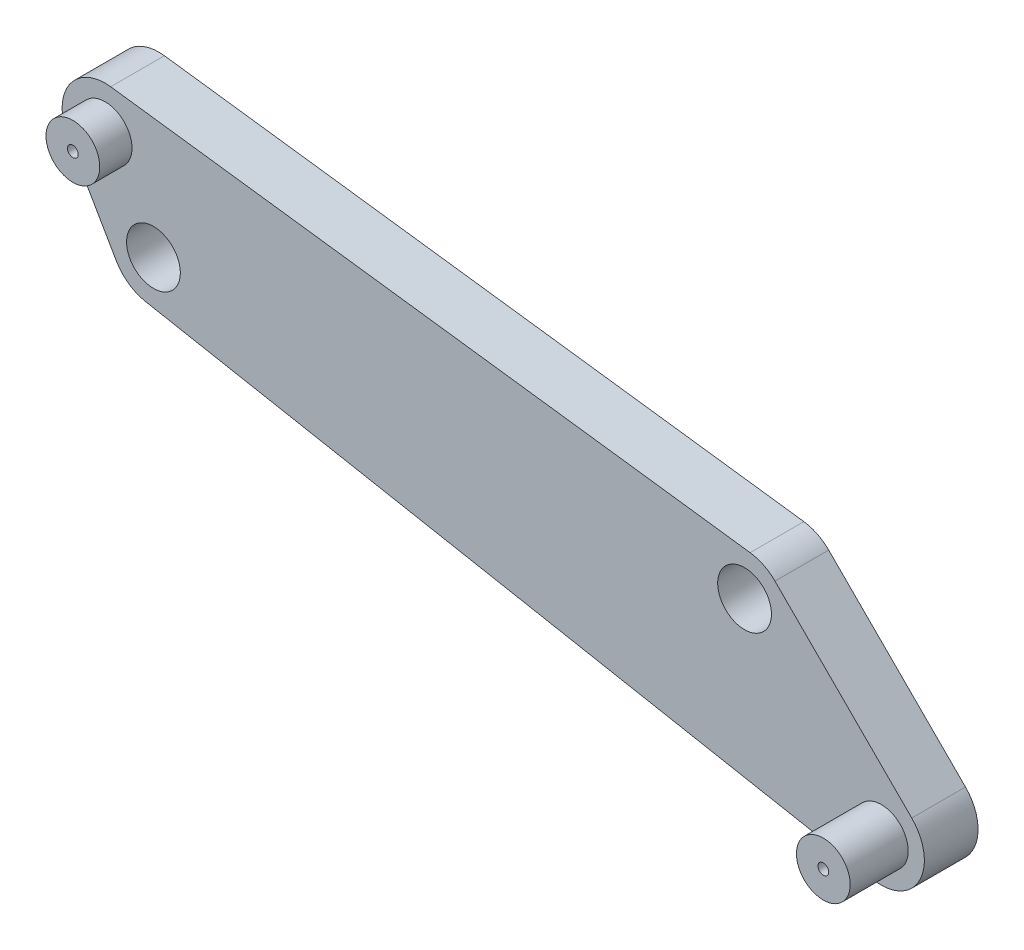
ISO-10303-21;
HEADER;
FILE_DESCRIPTION(('STEP AP214'),'2;1');
FILE_NAME('part.step','',(''),(''),'','','');
FILE_SCHEMA(('AUTOMOTIVE_DESIGN { 1 0 10303 214 1 1 1 1 }'));
ENDSEC;
DATA;
#1=APPLICATION_CONTEXT('core data for automotive mechanical design processes');
#2=APPLICATION_PROTOCOL_DEFINITION('international standard','automotive_design',2000,#1);
#3=PRODUCT_CONTEXT('',#1,'mechanical');
#4=PRODUCT('Part','Part','',(#3));
#5=PRODUCT_RELATED_PRODUCT_CATEGORY('part','',(#4));
#6=PRODUCT_DEFINITION_FORMATION('','',#4);
#7=PRODUCT_DEFINITION_CONTEXT('part definition',#1,'design');
#8=PRODUCT_DEFINITION('design','',#6,#7);
#9=PRODUCT_DEFINITION_SHAPE('','',#8);
#10=(LENGTH_UNIT() NAMED_UNIT(*) SI_UNIT(.MILLI.,.METRE.));
#11=(NAMED_UNIT(*) PLANE_ANGLE_UNIT() SI_UNIT($,.RADIAN.));
#12=(NAMED_UNIT(*) SI_UNIT($,.STERADIAN.) SOLID_ANGLE_UNIT());
#13=UNCERTAINTY_MEASURE_WITH_UNIT(LENGTH_MEASURE(1.E-05),#10,'distance_accuracy_value','');
#14=(GEOMETRIC_REPRESENTATION_CONTEXT(3) GLOBAL_UNCERTAINTY_ASSIGNED_CONTEXT((#13)) GLOBAL_UNIT_ASSIGNED_CONTEXT((#10,
#11,#12)) REPRESENTATION_CONTEXT('',''));
#15=CARTESIAN_POINT('',(0.,0.,0.));
#16=DIRECTION('',(0.,0.,1.));
#17=DIRECTION('',(1.,0.,0.));
#18=AXIS2_PLACEMENT_3D('',#15,#16,#17);
#19=CARTESIAN_POINT('',(-55.,0.,5.));
#20=DIRECTION('',(0.,0.,1.));
#21=DIRECTION('',(1.,0.,0.));
#22=AXIS2_PLACEMENT_3D('',#19,#20,#21);
#23=PLANE('',#22);
#24=CARTESIAN_POINT('',(0.,0.,5.));
#25=DIRECTION('',(0.,0.,1.));
#26=DIRECTION('',(1.,0.,0.));
#27=AXIS2_PLACEMENT_3D('',#24,#25,#26);
#28=CIRCLE('',#27,2.5);
#29=CARTESIAN_POINT('',(2.5,0.,5.));
#30=VERTEX_POINT('',#29);
#31=EDGE_CURVE('E188',#30,#30,#28,.T.);
#32=ORIENTED_EDGE('',*,*,#31,.F.);
#33=EDGE_LOOP('',(#32));
#34=FACE_BOUND('',#33,.T.);
#35=CARTESIAN_POINT('',(-55.,0.,5.));
#36=DIRECTION('',(0.,0.,1.));
#37=DIRECTION('',(1.,0.,0.));
#38=AXIS2_PLACEMENT_3D('',#35,#36,#37);
#39=CIRCLE('',#38,2.5);
#40=CARTESIAN_POINT('',(-52.5,0.,5.));
#41=VERTEX_POINT('',#40);
#42=EDGE_CURVE('E135',#41,#41,#39,.T.);
#43=ORIENTED_EDGE('',*,*,#42,.F.);
#44=EDGE_LOOP('',(#43));
#45=FACE_BOUND('',#44,.T.);
#46=CARTESIAN_POINT('',(-55.,0.,5.));
#47=DIRECTION('',(0.,0.,1.));
#48=DIRECTION('',(1.,0.,0.));
#49=AXIS2_PLACEMENT_3D('',#46,#47,#48);
#50=CIRCLE('',#49,4.00000000000001);
#51=CARTESIAN_POINT('',(-58.4641016151378,-2.,5.));
#52=VERTEX_POINT('',#51);
#53=CARTESIAN_POINT('',(-55.7387766284219,-3.93118418460618,5.));
#54=VERTEX_POINT('',#53);
#55=EDGE_CURVE('E146',#52,#54,#50,.T.);
#56=ORIENTED_EDGE('',*,*,#55,.T.);
#57=DIRECTION('',(0.98279604615154,-0.184694157105469,0.));
#58=VECTOR('',#57,1.);
#59=CARTESIAN_POINT('',(11.9891454329361,-16.6591062459639,5.));
#60=LINE('',#59,#58);
#61=CARTESIAN_POINT('',(11.9891454329361,-16.6591062459639,5.));
#62=VERTEX_POINT('',#61);
#63=EDGE_CURVE('E94',#54,#62,#60,.T.);
#64=ORIENTED_EDGE('',*,*,#63,.T.);
#65=CARTESIAN_POINT('',(12.7279220613579,-12.7279220613578,5.));
#66=DIRECTION('',(0.,0.,1.));
#67=DIRECTION('',(1.,0.,0.));
#68=AXIS2_PLACEMENT_3D('',#65,#66,#67);
#69=CIRCLE('',#68,4.);
#70=CARTESIAN_POINT('',(15.5563491861041,-9.89949493661158,5.));
#71=VERTEX_POINT('',#70);
#72=EDGE_CURVE('E161',#62,#71,#69,.T.);
#73=ORIENTED_EDGE('',*,*,#72,.T.);
#74=DIRECTION('',(-0.707106781186552,0.707106781186543,0.));
#75=VECTOR('',#74,1.);
#76=CARTESIAN_POINT('',(2.82842712474617,2.82842712474621,5.));
#77=LINE('',#76,#75);
#78=CARTESIAN_POINT('',(2.82842712474617,2.82842712474621,5.));
#79=VERTEX_POINT('',#78);
#80=EDGE_CURVE('E174',#71,#79,#77,.T.);
#81=ORIENTED_EDGE('',*,*,#80,.T.);
#82=CARTESIAN_POINT('',(0.,0.,5.));
#83=DIRECTION('',(0.,0.,1.));
#84=DIRECTION('',(1.,0.,0.));
#85=AXIS2_PLACEMENT_3D('',#82,#83,#84);
#86=CIRCLE('',#85,4.);
#87=CARTESIAN_POINT('',(0.519543088518699,3.96611585549041,5.));
#88=VERTEX_POINT('',#87);
#89=EDGE_CURVE('E113',#79,#88,#86,.T.);
#90=ORIENTED_EDGE('',*,*,#89,.T.);
#91=DIRECTION('',(-0.991528963872603,0.129885772129675,0.));
#92=VECTOR('',#91,1.);
#93=CARTESIAN_POINT('',(-58.9804569114813,11.7603444895504,5.));
#94=LINE('',#93,#92);
#95=CARTESIAN_POINT('',(-58.9804569114813,11.7603444895504,5.));
#96=VERTEX_POINT('',#95);
#97=EDGE_CURVE('E107',#88,#96,#94,.T.);
#98=ORIENTED_EDGE('',*,*,#97,.T.);
#99=CARTESIAN_POINT('',(-59.5,7.79422863405995,5.));
#100=DIRECTION('',(0.,0.,1.));
#101=DIRECTION('',(1.,0.,0.));
#102=AXIS2_PLACEMENT_3D('',#99,#100,#101);
#103=CIRCLE('',#102,4.);
#104=CARTESIAN_POINT('',(-62.9641016151377,5.79422863405996,5.));
#105=VERTEX_POINT('',#104);
#106=EDGE_CURVE('E111',#96,#105,#103,.T.);
#107=ORIENTED_EDGE('',*,*,#106,.T.);
#108=DIRECTION('',(0.499999999999997,-0.86602540378444,0.));
#109=VECTOR('',#108,1.);
#110=CARTESIAN_POINT('',(-58.4641016151378,-2.,5.));
#111=LINE('',#110,#109);
#112=EDGE_CURVE('E51',#105,#52,#111,.T.);
#113=ORIENTED_EDGE('',*,*,#112,.T.);
#114=EDGE_LOOP('',(#56,#64,#73,#81,#90,#98,#107,#113));
#115=FACE_BOUND('',#114,.T.);
#116=CARTESIAN_POINT('',(-59.5,7.79422863405995,5.));
#117=DIRECTION('',(0.,0.,1.));
#118=DIRECTION('',(1.,0.,0.));
#119=AXIS2_PLACEMENT_3D('',#116,#117,#118);
#120=CIRCLE('',#119,2.50000000000001);
#121=CARTESIAN_POINT('',(-57.,7.79422863405995,5.));
#122=VERTEX_POINT('',#121);
#123=EDGE_CURVE('E183',#122,#122,#120,.T.);
#124=ORIENTED_EDGE('',*,*,#123,.F.);
#125=EDGE_LOOP('',(#124));
#126=FACE_BOUND('',#125,.T.);
#127=CARTESIAN_POINT('',(12.7279220613579,-12.7279220613578,5.));
#128=DIRECTION('',(0.,0.,1.));
#129=DIRECTION('',(1.,0.,0.));
#130=AXIS2_PLACEMENT_3D('',#127,#128,#129);
#131=CIRCLE('',#130,2.5);
#132=CARTESIAN_POINT('',(15.2279220613579,-12.7279220613578,5.));
#133=VERTEX_POINT('',#132);
#134=EDGE_CURVE('E192',#133,#133,#131,.T.);
#135=ORIENTED_EDGE('',*,*,#134,.F.);
#136=EDGE_LOOP('',(#135));
#137=FACE_BOUND('',#136,.T.);
#138=ADVANCED_FACE('F34',(#34,#45,#115,#126,#137),#23,.T.);
#139=CARTESIAN_POINT('',(-55.,0.,0.));
#140=DIRECTION('',(0.,0.,1.));
#141=DIRECTION('',(1.,0.,0.));
#142=AXIS2_PLACEMENT_3D('',#139,#140,#141);
#143=PLANE('',#142);
#144=CARTESIAN_POINT('',(-55.,0.,0.));
#145=DIRECTION('',(0.,0.,1.));
#146=DIRECTION('',(1.,0.,0.));
#147=AXIS2_PLACEMENT_3D('',#144,#145,#146);
#148=CIRCLE('',#147,4.00000000000001);
#149=CARTESIAN_POINT('',(-58.4641016151378,-2.,0.));
#150=VERTEX_POINT('',#149);
#151=CARTESIAN_POINT('',(-55.7387766284219,-3.93118418460618,0.));
#152=VERTEX_POINT('',#151);
#153=EDGE_CURVE('E131',#150,#152,#148,.T.);
#154=ORIENTED_EDGE('',*,*,#153,.F.);
#155=DIRECTION('',(0.499999999999997,-0.86602540378444,0.));
#156=VECTOR('',#155,1.);
#157=CARTESIAN_POINT('',(-58.4641016151378,-2.,0.));
#158=LINE('',#157,#156);
#159=CARTESIAN_POINT('',(-62.9641016151377,5.79422863405996,0.));
#160=VERTEX_POINT('',#159);
#161=EDGE_CURVE('E86',#160,#150,#158,.T.);
#162=ORIENTED_EDGE('',*,*,#161,.F.);
#163=CARTESIAN_POINT('',(-59.5,7.79422863405995,0.));
#164=DIRECTION('',(0.,0.,1.));
#165=DIRECTION('',(1.,0.,0.));
#166=AXIS2_PLACEMENT_3D('',#163,#164,#165);
#167=CIRCLE('',#166,4.);
#168=CARTESIAN_POINT('',(-58.9804569114813,11.7603444895504,0.));
#169=VERTEX_POINT('',#168);
#170=EDGE_CURVE('E80',#169,#160,#167,.T.);
#171=ORIENTED_EDGE('',*,*,#170,.F.);
#172=DIRECTION('',(-0.991528963872603,0.129885772129675,0.));
#173=VECTOR('',#172,1.);
#174=CARTESIAN_POINT('',(-58.9804569114813,11.7603444895504,0.));
#175=LINE('',#174,#173);
#176=CARTESIAN_POINT('',(0.519543088518699,3.96611585549041,0.));
#177=VERTEX_POINT('',#176);
#178=EDGE_CURVE('E121',#177,#169,#175,.T.);
#179=ORIENTED_EDGE('',*,*,#178,.F.);
#180=CARTESIAN_POINT('',(0.,0.,0.));
#181=DIRECTION('',(0.,0.,1.));
#182=DIRECTION('',(1.,0.,0.));
#183=AXIS2_PLACEMENT_3D('',#180,#181,#182);
#184=CIRCLE('',#183,4.);
#185=CARTESIAN_POINT('',(2.82842712474617,2.82842712474621,0.));
#186=VERTEX_POINT('',#185);
#187=EDGE_CURVE('E141',#186,#177,#184,.T.);
#188=ORIENTED_EDGE('',*,*,#187,.F.);
#189=DIRECTION('',(-0.707106781186552,0.707106781186543,0.));
#190=VECTOR('',#189,1.);
#191=CARTESIAN_POINT('',(2.82842712474617,2.82842712474621,0.));
#192=LINE('',#191,#190);
#193=CARTESIAN_POINT('',(15.5563491861041,-9.89949493661158,0.));
#194=VERTEX_POINT('',#193);
#195=EDGE_CURVE('E139',#194,#186,#192,.T.);
#196=ORIENTED_EDGE('',*,*,#195,.F.);
#197=CARTESIAN_POINT('',(12.7279220613579,-12.7279220613578,0.));
#198=DIRECTION('',(0.,0.,1.));
#199=DIRECTION('',(1.,0.,0.));
#200=AXIS2_PLACEMENT_3D('',#197,#198,#199);
#201=CIRCLE('',#200,4.);
#202=CARTESIAN_POINT('',(11.9891454329361,-16.6591062459639,0.));
#203=VERTEX_POINT('',#202);
#204=EDGE_CURVE('E137',#203,#194,#201,.T.);
#205=ORIENTED_EDGE('',*,*,#204,.F.);
#206=DIRECTION('',(0.98279604615154,-0.184694157105469,0.));
#207=VECTOR('',#206,1.);
#208=CARTESIAN_POINT('',(11.9891454329361,-16.6591062459639,0.));
#209=LINE('',#208,#207);
#210=EDGE_CURVE('E134',#152,#203,#209,.T.);
#211=ORIENTED_EDGE('',*,*,#210,.F.);
#212=EDGE_LOOP('',(#154,#162,#171,#179,#188,#196,#205,#211));
#213=FACE_BOUND('',#212,.T.);
#214=CARTESIAN_POINT('',(-55.,0.,0.));
#215=DIRECTION('',(0.,0.,1.));
#216=DIRECTION('',(1.,0.,0.));
#217=AXIS2_PLACEMENT_3D('',#214,#215,#216);
#218=CIRCLE('',#217,2.5);
#219=CARTESIAN_POINT('',(-52.5,0.,0.));
#220=VERTEX_POINT('',#219);
#221=EDGE_CURVE('E180',#220,#220,#218,.T.);
#222=ORIENTED_EDGE('',*,*,#221,.T.);
#223=EDGE_LOOP('',(#222));
#224=FACE_BOUND('',#223,.T.);
#225=CARTESIAN_POINT('',(0.,0.,0.));
#226=DIRECTION('',(0.,0.,1.));
#227=DIRECTION('',(1.,0.,0.));
#228=AXIS2_PLACEMENT_3D('',#225,#226,#227);
#229=CIRCLE('',#228,2.5);
#230=CARTESIAN_POINT('',(2.5,0.,0.));
#231=VERTEX_POINT('',#230);
#232=EDGE_CURVE('E189',#231,#231,#229,.T.);
#233=ORIENTED_EDGE('',*,*,#232,.T.);
#234=EDGE_LOOP('',(#233));
#235=FACE_BOUND('',#234,.T.);
#236=CARTESIAN_POINT('',(-59.5,7.79422863405995,0.));
#237=DIRECTION('',(0.,0.,-1.));
#238=DIRECTION('',(-1.,0.,0.));
#239=AXIS2_PLACEMENT_3D('',#236,#237,#238);
#240=CIRCLE('',#239,0.499999999999999);
#241=CARTESIAN_POINT('',(-60.,7.79422863405995,0.));
#242=VERTEX_POINT('',#241);
#243=EDGE_CURVE('E201',#242,#242,#240,.T.);
#244=ORIENTED_EDGE('',*,*,#243,.F.);
#245=EDGE_LOOP('',(#244));
#246=FACE_BOUND('',#245,.T.);
#247=CARTESIAN_POINT('',(12.7279220613579,-12.7279220613578,0.));
#248=DIRECTION('',(0.,0.,-1.));
#249=DIRECTION('',(-1.,0.,0.));
#250=AXIS2_PLACEMENT_3D('',#247,#248,#249);
#251=CIRCLE('',#250,0.500000000000001);
#252=CARTESIAN_POINT('',(12.2279220613579,-12.7279220613578,0.));
#253=VERTEX_POINT('',#252);
#254=EDGE_CURVE('E204',#253,#253,#251,.T.);
#255=ORIENTED_EDGE('',*,*,#254,.F.);
#256=EDGE_LOOP('',(#255));
#257=FACE_BOUND('',#256,.T.);
#258=ADVANCED_FACE('F165',(#213,#224,#235,#246,#257),#143,.F.);
#259=CARTESIAN_POINT('',(-55.,0.,5.));
#260=DIRECTION('',(0.,0.,-1.));
#261=DIRECTION('',(-1.,0.,0.));
#262=AXIS2_PLACEMENT_3D('',#259,#260,#261);
#263=CYLINDRICAL_SURFACE('',#262,4.00000000000001);
#264=ORIENTED_EDGE('',*,*,#153,.T.);
#265=DIRECTION('',(0.,0.,-1.));
#266=VECTOR('',#265,1.);
#267=CARTESIAN_POINT('',(-55.7387766284219,-3.93118418460618,5.));
#268=LINE('',#267,#266);
#269=EDGE_CURVE('E11',#54,#152,#268,.T.);
#270=ORIENTED_EDGE('',*,*,#269,.F.);
#271=ORIENTED_EDGE('',*,*,#55,.F.);
#272=DIRECTION('',(0.,0.,-1.));
#273=VECTOR('',#272,1.);
#274=CARTESIAN_POINT('',(-58.4641016151378,-2.,5.));
#275=LINE('',#274,#273);
#276=EDGE_CURVE('E127',#52,#150,#275,.T.);
#277=ORIENTED_EDGE('',*,*,#276,.T.);
#278=EDGE_LOOP('',(#264,#270,#271,#277));
#279=FACE_BOUND('',#278,.T.);
#280=ADVANCED_FACE('F36',(#279),#263,.T.);
#281=CARTESIAN_POINT('',(11.9891454329361,-16.6591062459639,5.));
#282=DIRECTION('',(0.184694157105469,0.98279604615154,0.));
#283=DIRECTION('',(-0.98279604615154,0.184694157105469,0.));
#284=AXIS2_PLACEMENT_3D('',#281,#282,#283);
#285=PLANE('',#284);
#286=ORIENTED_EDGE('',*,*,#210,.T.);
#287=DIRECTION('',(0.,0.,-1.));
#288=VECTOR('',#287,1.);
#289=CARTESIAN_POINT('',(11.9891454329361,-16.6591062459639,5.));
#290=LINE('',#289,#288);
#291=EDGE_CURVE('E43',#62,#203,#290,.T.);
#292=ORIENTED_EDGE('',*,*,#291,.F.);
#293=ORIENTED_EDGE('',*,*,#63,.F.);
#294=ORIENTED_EDGE('',*,*,#269,.T.);
#295=EDGE_LOOP('',(#286,#292,#293,#294));
#296=FACE_BOUND('',#295,.T.);
#297=ADVANCED_FACE('F253',(#296),#285,.F.);
#298=CARTESIAN_POINT('',(12.7279220613579,-12.7279220613578,5.));
#299=DIRECTION('',(0.,0.,-1.));
#300=DIRECTION('',(-1.,0.,0.));
#301=AXIS2_PLACEMENT_3D('',#298,#299,#300);
#302=CYLINDRICAL_SURFACE('',#301,4.);
#303=ORIENTED_EDGE('',*,*,#204,.T.);
#304=DIRECTION('',(0.,0.,-1.));
#305=VECTOR('',#304,1.);
#306=CARTESIAN_POINT('',(15.5563491861041,-9.89949493661158,5.));
#307=LINE('',#306,#305);
#308=EDGE_CURVE('E153',#71,#194,#307,.T.);
#309=ORIENTED_EDGE('',*,*,#308,.F.);
#310=ORIENTED_EDGE('',*,*,#72,.F.);
#311=ORIENTED_EDGE('',*,*,#291,.T.);
#312=EDGE_LOOP('',(#303,#309,#310,#311));
#313=FACE_BOUND('',#312,.T.);
#314=ADVANCED_FACE('F159',(#313),#302,.T.);
#315=CARTESIAN_POINT('',(2.82842712474617,2.82842712474621,5.));
#316=DIRECTION('',(-0.707106781186543,-0.707106781186552,0.));
#317=DIRECTION('',(0.707106781186552,-0.707106781186543,0.));
#318=AXIS2_PLACEMENT_3D('',#315,#316,#317);
#319=PLANE('',#318);
#320=ORIENTED_EDGE('',*,*,#195,.T.);
#321=DIRECTION('',(0.,0.,-1.));
#322=VECTOR('',#321,1.);
#323=CARTESIAN_POINT('',(2.82842712474617,2.82842712474621,5.));
#324=LINE('',#323,#322);
#325=EDGE_CURVE('E150',#79,#186,#324,.T.);
#326=ORIENTED_EDGE('',*,*,#325,.F.);
#327=ORIENTED_EDGE('',*,*,#80,.F.);
#328=ORIENTED_EDGE('',*,*,#308,.T.);
#329=EDGE_LOOP('',(#320,#326,#327,#328));
#330=FACE_BOUND('',#329,.T.);
#331=ADVANCED_FACE('F170',(#330),#319,.F.);
#332=CARTESIAN_POINT('',(0.,0.,5.));
#333=DIRECTION('',(0.,0.,-1.));
#334=DIRECTION('',(-1.,0.,0.));
#335=AXIS2_PLACEMENT_3D('',#332,#333,#334);
#336=CYLINDRICAL_SURFACE('',#335,4.);
#337=ORIENTED_EDGE('',*,*,#187,.T.);
#338=DIRECTION('',(0.,0.,-1.));
#339=VECTOR('',#338,1.);
#340=CARTESIAN_POINT('',(0.519543088518699,3.96611585549041,5.));
#341=LINE('',#340,#339);
#342=EDGE_CURVE('E122',#88,#177,#341,.T.);
#343=ORIENTED_EDGE('',*,*,#342,.F.);
#344=ORIENTED_EDGE('',*,*,#89,.F.);
#345=ORIENTED_EDGE('',*,*,#325,.T.);
#346=EDGE_LOOP('',(#337,#343,#344,#345));
#347=FACE_BOUND('',#346,.T.);
#348=ADVANCED_FACE('F173',(#347),#336,.T.);
#349=CARTESIAN_POINT('',(-58.9804569114813,11.7603444895504,5.));
#350=DIRECTION('',(-0.129885772129675,-0.991528963872603,0.));
#351=DIRECTION('',(0.991528963872603,-0.129885772129675,0.));
#352=AXIS2_PLACEMENT_3D('',#349,#350,#351);
#353=PLANE('',#352);
#354=ORIENTED_EDGE('',*,*,#178,.T.);
#355=DIRECTION('',(0.,0.,-1.));
#356=VECTOR('',#355,1.);
#357=CARTESIAN_POINT('',(-58.9804569114813,11.7603444895504,5.));
#358=LINE('',#357,#356);
#359=EDGE_CURVE('E118',#96,#169,#358,.T.);
#360=ORIENTED_EDGE('',*,*,#359,.F.);
#361=ORIENTED_EDGE('',*,*,#97,.F.);
#362=ORIENTED_EDGE('',*,*,#342,.T.);
#363=EDGE_LOOP('',(#354,#360,#361,#362));
#364=FACE_BOUND('',#363,.T.);
#365=ADVANCED_FACE('F119',(#364),#353,.F.);
#366=CARTESIAN_POINT('',(-59.5,7.79422863405995,5.));
#367=DIRECTION('',(0.,0.,-1.));
#368=DIRECTION('',(-1.,0.,0.));
#369=AXIS2_PLACEMENT_3D('',#366,#367,#368);
#370=CYLINDRICAL_SURFACE('',#369,4.);
#371=ORIENTED_EDGE('',*,*,#170,.T.);
#372=DIRECTION('',(0.,0.,-1.));
#373=VECTOR('',#372,1.);
#374=CARTESIAN_POINT('',(-62.9641016151377,5.79422863405996,5.));
#375=LINE('',#374,#373);
#376=EDGE_CURVE('E123',#105,#160,#375,.T.);
#377=ORIENTED_EDGE('',*,*,#376,.F.);
#378=ORIENTED_EDGE('',*,*,#106,.F.);
#379=ORIENTED_EDGE('',*,*,#359,.T.);
#380=EDGE_LOOP('',(#371,#377,#378,#379));
#381=FACE_BOUND('',#380,.T.);
#382=ADVANCED_FACE('F125',(#381),#370,.T.);
#383=CARTESIAN_POINT('',(-58.4641016151378,-2.,5.));
#384=DIRECTION('',(0.86602540378444,0.499999999999997,0.));
#385=DIRECTION('',(-0.499999999999997,0.86602540378444,0.));
#386=AXIS2_PLACEMENT_3D('',#383,#384,#385);
#387=PLANE('',#386);
#388=ORIENTED_EDGE('',*,*,#161,.T.);
#389=ORIENTED_EDGE('',*,*,#276,.F.);
#390=ORIENTED_EDGE('',*,*,#112,.F.);
#391=ORIENTED_EDGE('',*,*,#376,.T.);
#392=EDGE_LOOP('',(#388,#389,#390,#391));
#393=FACE_BOUND('',#392,.T.);
#394=ADVANCED_FACE('F241',(#393),#387,.F.);
#395=CARTESIAN_POINT('',(-55.,0.,5.));
#396=DIRECTION('',(0.,0.,-1.));
#397=DIRECTION('',(-1.,0.,0.));
#398=AXIS2_PLACEMENT_3D('',#395,#396,#397);
#399=CYLINDRICAL_SURFACE('',#398,2.5);
#400=ORIENTED_EDGE('',*,*,#42,.T.);
#401=EDGE_LOOP('',(#400));
#402=FACE_BOUND('',#401,.T.);
#403=ORIENTED_EDGE('',*,*,#221,.F.);
#404=EDGE_LOOP('',(#403));
#405=FACE_BOUND('',#404,.T.);
#406=ADVANCED_FACE('F238',(#402,#405),#399,.F.);
#407=CARTESIAN_POINT('',(0.,0.,5.));
#408=DIRECTION('',(0.,0.,-1.));
#409=DIRECTION('',(-1.,0.,0.));
#410=AXIS2_PLACEMENT_3D('',#407,#408,#409);
#411=CYLINDRICAL_SURFACE('',#410,2.5);
#412=ORIENTED_EDGE('',*,*,#31,.T.);
#413=EDGE_LOOP('',(#412));
#414=FACE_BOUND('',#413,.T.);
#415=ORIENTED_EDGE('',*,*,#232,.F.);
#416=EDGE_LOOP('',(#415));
#417=FACE_BOUND('',#416,.T.);
#418=ADVANCED_FACE('F275',(#414,#417),#411,.F.);
#419=CARTESIAN_POINT('',(-59.5,7.79422863405995,8.));
#420=DIRECTION('',(0.,0.,-1.));
#421=DIRECTION('',(-1.,0.,0.));
#422=AXIS2_PLACEMENT_3D('',#419,#420,#421);
#423=CYLINDRICAL_SURFACE('',#422,2.50000000000002);
#424=ORIENTED_EDGE('',*,*,#123,.T.);
#425=EDGE_LOOP('',(#424));
#426=FACE_BOUND('',#425,.T.);
#427=CARTESIAN_POINT('',(-59.5,7.79422863405995,8.));
#428=DIRECTION('',(0.,0.,-1.));
#429=DIRECTION('',(-1.,0.,0.));
#430=AXIS2_PLACEMENT_3D('',#427,#428,#429);
#431=CIRCLE('',#430,2.50000000000002);
#432=CARTESIAN_POINT('',(-62.,7.79422863405995,8.));
#433=VERTEX_POINT('',#432);
#434=EDGE_CURVE('E197',#433,#433,#431,.T.);
#435=ORIENTED_EDGE('',*,*,#434,.T.);
#436=EDGE_LOOP('',(#435));
#437=FACE_BOUND('',#436,.T.);
#438=ADVANCED_FACE('F280',(#426,#437),#423,.T.);
#439=CARTESIAN_POINT('',(-59.5,7.79422863405995,8.));
#440=DIRECTION('',(0.,0.,-1.));
#441=DIRECTION('',(-1.,0.,0.));
#442=AXIS2_PLACEMENT_3D('',#439,#440,#441);
#443=PLANE('',#442);
#444=CARTESIAN_POINT('',(-59.5,7.79422863405995,8.));
#445=DIRECTION('',(0.,0.,-1.));
#446=DIRECTION('',(-1.,0.,0.));
#447=AXIS2_PLACEMENT_3D('',#444,#445,#446);
#448=CIRCLE('',#447,0.499999999999999);
#449=CARTESIAN_POINT('',(-60.,7.79422863405995,8.));
#450=VERTEX_POINT('',#449);
#451=EDGE_CURVE('E200',#450,#450,#448,.T.);
#452=ORIENTED_EDGE('',*,*,#451,.T.);
#453=EDGE_LOOP('',(#452));
#454=FACE_BOUND('',#453,.T.);
#455=ORIENTED_EDGE('',*,*,#434,.F.);
#456=EDGE_LOOP('',(#455));
#457=FACE_BOUND('',#456,.T.);
#458=ADVANCED_FACE('F284',(#454,#457),#443,.F.);
#459=CARTESIAN_POINT('',(-59.5,7.79422863405995,8.));
#460=DIRECTION('',(0.,0.,-1.));
#461=DIRECTION('',(-1.,0.,0.));
#462=AXIS2_PLACEMENT_3D('',#459,#460,#461);
#463=CYLINDRICAL_SURFACE('',#462,0.499999999999999);
#464=ORIENTED_EDGE('',*,*,#451,.F.);
#465=EDGE_LOOP('',(#464));
#466=FACE_BOUND('',#465,.T.);
#467=ORIENTED_EDGE('',*,*,#243,.T.);
#468=EDGE_LOOP('',(#467));
#469=FACE_BOUND('',#468,.T.);
#470=ADVANCED_FACE('F294',(#466,#469),#463,.F.);
#471=CARTESIAN_POINT('',(12.7279220613579,-12.7279220613578,8.));
#472=DIRECTION('',(0.,0.,-1.));
#473=DIRECTION('',(-1.,0.,0.));
#474=AXIS2_PLACEMENT_3D('',#471,#472,#473);
#475=CYLINDRICAL_SURFACE('',#474,2.5);
#476=ORIENTED_EDGE('',*,*,#134,.T.);
#477=EDGE_LOOP('',(#476));
#478=FACE_BOUND('',#477,.T.);
#479=CARTESIAN_POINT('',(12.7279220613579,-12.7279220613578,10.4));
#480=DIRECTION('',(0.,0.,1.));
#481=DIRECTION('',(1.,0.,0.));
#482=AXIS2_PLACEMENT_3D('',#479,#480,#481);
#483=CIRCLE('',#482,2.5);
#484=CARTESIAN_POINT('',(15.2279220613579,-12.7279220613578,10.4));
#485=VERTEX_POINT('',#484);
#486=EDGE_CURVE('E209',#485,#485,#483,.T.);
#487=ORIENTED_EDGE('',*,*,#486,.F.);
#488=EDGE_LOOP('',(#487));
#489=FACE_BOUND('',#488,.T.);
#490=ADVANCED_FACE('F225',(#478,#489),#475,.T.);
#491=CARTESIAN_POINT('',(12.7279220613579,-12.7279220613578,8.));
#492=DIRECTION('',(0.,0.,-1.));
#493=DIRECTION('',(-1.,0.,0.));
#494=AXIS2_PLACEMENT_3D('',#491,#492,#493);
#495=CYLINDRICAL_SURFACE('',#494,0.500000000000001);
#496=ORIENTED_EDGE('',*,*,#254,.T.);
#497=EDGE_LOOP('',(#496));
#498=FACE_BOUND('',#497,.T.);
#499=CARTESIAN_POINT('',(12.7279220613579,-12.7279220613578,10.4));
#500=DIRECTION('',(0.,0.,1.));
#501=DIRECTION('',(1.,0.,0.));
#502=AXIS2_PLACEMENT_3D('',#499,#500,#501);
#503=CIRCLE('',#502,0.500000000000001);
#504=CARTESIAN_POINT('',(13.2279220613579,-12.7279220613578,10.4));
#505=VERTEX_POINT('',#504);
#506=EDGE_CURVE('E212',#505,#505,#503,.T.);
#507=ORIENTED_EDGE('',*,*,#506,.T.);
#508=EDGE_LOOP('',(#507));
#509=FACE_BOUND('',#508,.T.);
#510=ADVANCED_FACE('F216',(#498,#509),#495,.F.);
#511=CARTESIAN_POINT('',(12.7279220613579,-12.7279220613578,10.4));
#512=DIRECTION('',(0.,0.,1.));
#513=DIRECTION('',(1.,0.,0.));
#514=AXIS2_PLACEMENT_3D('',#511,#512,#513);
#515=PLANE('',#514);
#516=ORIENTED_EDGE('',*,*,#486,.T.);
#517=EDGE_LOOP('',(#516));
#518=FACE_BOUND('',#517,.T.);
#519=ORIENTED_EDGE('',*,*,#506,.F.);
#520=EDGE_LOOP('',(#519));
#521=FACE_BOUND('',#520,.T.);
#522=ADVANCED_FACE('F218',(#518,#521),#515,.T.);
#523=CLOSED_SHELL('',(#138,#258,#280,#297,#314,#331,#348,#365,#382,#394,#406,#418,#438,#458,
#470,#490,#510,#522));
#524=MANIFOLD_SOLID_BREP('B2',#523);
#525=ADVANCED_BREP_SHAPE_REPRESENTATION('',(#18,#524),#14);
#526=SHAPE_DEFINITION_REPRESENTATION(#9,#525);
ENDSEC;
END-ISO-10303-21;
